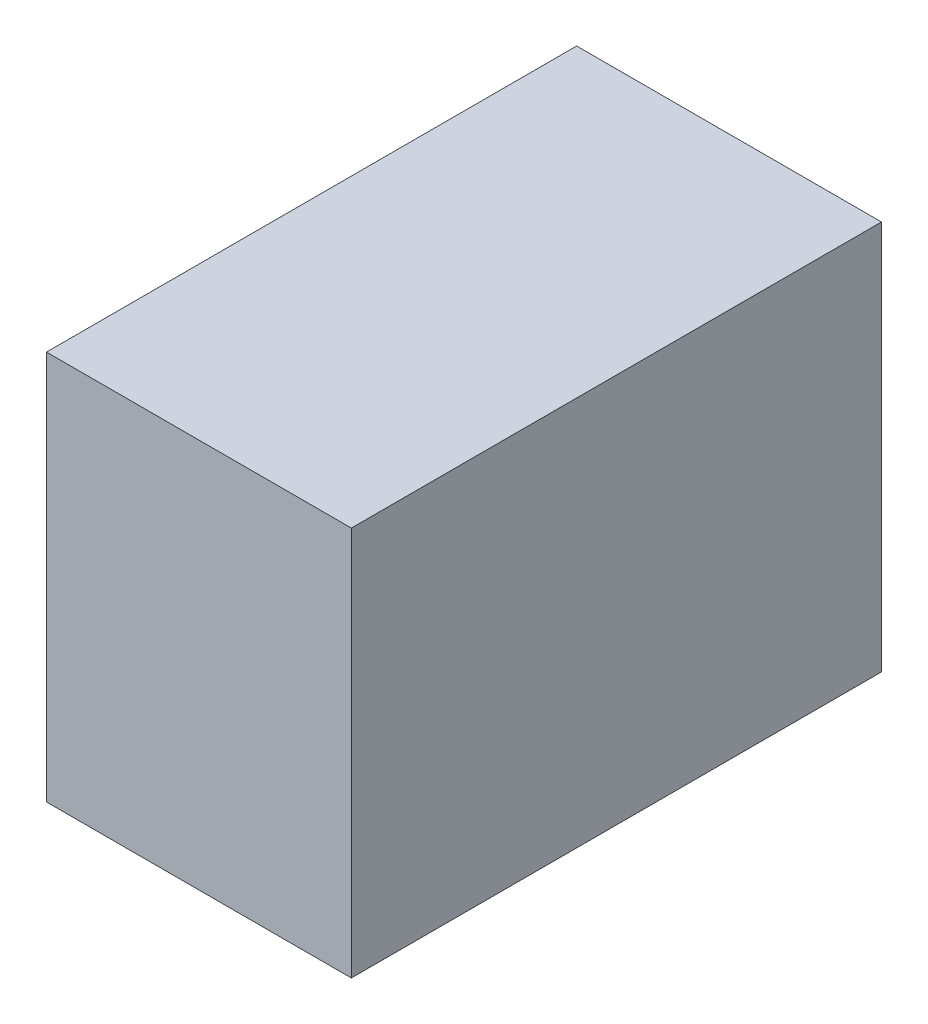
ISO-10303-21;
HEADER;
FILE_DESCRIPTION(('STEP AP214'),'2;1');
FILE_NAME('part.step','',(''),(''),'','','');
FILE_SCHEMA(('AUTOMOTIVE_DESIGN { 1 0 10303 214 1 1 1 1 }'));
ENDSEC;
DATA;
#1=APPLICATION_CONTEXT('core data for automotive mechanical design processes');
#2=APPLICATION_PROTOCOL_DEFINITION('international standard','automotive_design',2000,#1);
#3=PRODUCT_CONTEXT('',#1,'mechanical');
#4=PRODUCT('Part','Part','',(#3));
#5=PRODUCT_RELATED_PRODUCT_CATEGORY('part','',(#4));
#6=PRODUCT_DEFINITION_FORMATION('','',#4);
#7=PRODUCT_DEFINITION_CONTEXT('part definition',#1,'design');
#8=PRODUCT_DEFINITION('design','',#6,#7);
#9=PRODUCT_DEFINITION_SHAPE('','',#8);
#10=(LENGTH_UNIT() NAMED_UNIT(*) SI_UNIT(.MILLI.,.METRE.));
#11=(NAMED_UNIT(*) PLANE_ANGLE_UNIT() SI_UNIT($,.RADIAN.));
#12=(NAMED_UNIT(*) SI_UNIT($,.STERADIAN.) SOLID_ANGLE_UNIT());
#13=UNCERTAINTY_MEASURE_WITH_UNIT(LENGTH_MEASURE(1.E-05),#10,'distance_accuracy_value','');
#14=(GEOMETRIC_REPRESENTATION_CONTEXT(3) GLOBAL_UNCERTAINTY_ASSIGNED_CONTEXT((#13)) GLOBAL_UNIT_ASSIGNED_CONTEXT((#10,
#11,#12)) REPRESENTATION_CONTEXT('',''));
#15=CARTESIAN_POINT('',(0.,0.,0.));
#16=DIRECTION('',(0.,0.,1.));
#17=DIRECTION('',(1.,0.,0.));
#18=AXIS2_PLACEMENT_3D('',#15,#16,#17);
#19=CARTESIAN_POINT('',(2.875,3.675,10.));
#20=DIRECTION('',(-1.,0.,0.));
#21=DIRECTION('',(0.,-1.,0.));
#22=AXIS2_PLACEMENT_3D('',#19,#20,#21);
#23=PLANE('',#22);
#24=DIRECTION('',(0.,1.,0.));
#25=VECTOR('',#24,1.);
#26=CARTESIAN_POINT('',(2.875,3.675,0.));
#27=LINE('',#26,#25);
#28=CARTESIAN_POINT('',(2.875,-3.675,0.));
#29=VERTEX_POINT('',#28);
#30=CARTESIAN_POINT('',(2.875,3.675,0.));
#31=VERTEX_POINT('',#30);
#32=EDGE_CURVE('E96',#29,#31,#27,.T.);
#33=ORIENTED_EDGE('',*,*,#32,.T.);
#34=DIRECTION('',(0.,0.,-1.));
#35=VECTOR('',#34,1.);
#36=CARTESIAN_POINT('',(2.875,3.675,10.));
#37=LINE('',#36,#35);
#38=CARTESIAN_POINT('',(2.875,3.675,10.));
#39=VERTEX_POINT('',#38);
#40=EDGE_CURVE('E11',#39,#31,#37,.T.);
#41=ORIENTED_EDGE('',*,*,#40,.F.);
#42=DIRECTION('',(0.,1.,0.));
#43=VECTOR('',#42,1.);
#44=CARTESIAN_POINT('',(2.875,3.675,10.));
#45=LINE('',#44,#43);
#46=CARTESIAN_POINT('',(2.875,-3.675,10.));
#47=VERTEX_POINT('',#46);
#48=EDGE_CURVE('E84',#47,#39,#45,.T.);
#49=ORIENTED_EDGE('',*,*,#48,.F.);
#50=DIRECTION('',(0.,0.,-1.));
#51=VECTOR('',#50,1.);
#52=CARTESIAN_POINT('',(2.875,-3.675,10.));
#53=LINE('',#52,#51);
#54=EDGE_CURVE('E92',#47,#29,#53,.T.);
#55=ORIENTED_EDGE('',*,*,#54,.T.);
#56=EDGE_LOOP('',(#33,#41,#49,#55));
#57=FACE_BOUND('',#56,.T.);
#58=ADVANCED_FACE('F33',(#57),#23,.F.);
#59=CARTESIAN_POINT('',(-2.875,3.675,10.));
#60=DIRECTION('',(0.,-1.,0.));
#61=DIRECTION('',(0.,0.,-1.));
#62=AXIS2_PLACEMENT_3D('',#59,#60,#61);
#63=PLANE('',#62);
#64=DIRECTION('',(-1.,0.,0.));
#65=VECTOR('',#64,1.);
#66=CARTESIAN_POINT('',(-2.875,3.675,0.));
#67=LINE('',#66,#65);
#68=CARTESIAN_POINT('',(-2.875,3.675,0.));
#69=VERTEX_POINT('',#68);
#70=EDGE_CURVE('E88',#31,#69,#67,.T.);
#71=ORIENTED_EDGE('',*,*,#70,.T.);
#72=DIRECTION('',(0.,0.,-1.));
#73=VECTOR('',#72,1.);
#74=CARTESIAN_POINT('',(-2.875,3.675,10.));
#75=LINE('',#74,#73);
#76=CARTESIAN_POINT('',(-2.875,3.675,10.));
#77=VERTEX_POINT('',#76);
#78=EDGE_CURVE('E41',#77,#69,#75,.T.);
#79=ORIENTED_EDGE('',*,*,#78,.F.);
#80=DIRECTION('',(-1.,0.,0.));
#81=VECTOR('',#80,1.);
#82=CARTESIAN_POINT('',(-2.875,3.675,10.));
#83=LINE('',#82,#81);
#84=EDGE_CURVE('E79',#39,#77,#83,.T.);
#85=ORIENTED_EDGE('',*,*,#84,.F.);
#86=ORIENTED_EDGE('',*,*,#40,.T.);
#87=EDGE_LOOP('',(#71,#79,#85,#86));
#88=FACE_BOUND('',#87,.T.);
#89=ADVANCED_FACE('F87',(#88),#63,.F.);
#90=CARTESIAN_POINT('',(-2.875,3.675,10.));
#91=DIRECTION('',(1.,0.,0.));
#92=DIRECTION('',(0.,1.,0.));
#93=AXIS2_PLACEMENT_3D('',#90,#91,#92);
#94=PLANE('',#93);
#95=DIRECTION('',(0.,-1.,0.));
#96=VECTOR('',#95,1.);
#97=CARTESIAN_POINT('',(-2.875,3.675,0.));
#98=LINE('',#97,#96);
#99=CARTESIAN_POINT('',(-2.875,-3.675,0.));
#100=VERTEX_POINT('',#99);
#101=EDGE_CURVE('E66',#69,#100,#98,.T.);
#102=ORIENTED_EDGE('',*,*,#101,.T.);
#103=DIRECTION('',(0.,0.,-1.));
#104=VECTOR('',#103,1.);
#105=CARTESIAN_POINT('',(-2.875,-3.675,10.));
#106=LINE('',#105,#104);
#107=CARTESIAN_POINT('',(-2.875,-3.675,10.));
#108=VERTEX_POINT('',#107);
#109=EDGE_CURVE('E89',#108,#100,#106,.T.);
#110=ORIENTED_EDGE('',*,*,#109,.F.);
#111=DIRECTION('',(0.,-1.,0.));
#112=VECTOR('',#111,1.);
#113=CARTESIAN_POINT('',(-2.875,3.675,10.));
#114=LINE('',#113,#112);
#115=EDGE_CURVE('E82',#77,#108,#114,.T.);
#116=ORIENTED_EDGE('',*,*,#115,.F.);
#117=ORIENTED_EDGE('',*,*,#78,.T.);
#118=EDGE_LOOP('',(#102,#110,#116,#117));
#119=FACE_BOUND('',#118,.T.);
#120=ADVANCED_FACE('F90',(#119),#94,.F.);
#121=CARTESIAN_POINT('',(-2.875,-3.675,10.));
#122=DIRECTION('',(0.,1.,0.));
#123=DIRECTION('',(0.,0.,1.));
#124=AXIS2_PLACEMENT_3D('',#121,#122,#123);
#125=PLANE('',#124);
#126=DIRECTION('',(1.,0.,0.));
#127=VECTOR('',#126,1.);
#128=CARTESIAN_POINT('',(-2.875,-3.675,0.));
#129=LINE('',#128,#127);
#130=EDGE_CURVE('E72',#100,#29,#129,.T.);
#131=ORIENTED_EDGE('',*,*,#130,.T.);
#132=ORIENTED_EDGE('',*,*,#54,.F.);
#133=DIRECTION('',(1.,0.,0.));
#134=VECTOR('',#133,1.);
#135=CARTESIAN_POINT('',(-2.875,-3.675,10.));
#136=LINE('',#135,#134);
#137=EDGE_CURVE('E49',#108,#47,#136,.T.);
#138=ORIENTED_EDGE('',*,*,#137,.F.);
#139=ORIENTED_EDGE('',*,*,#109,.T.);
#140=EDGE_LOOP('',(#131,#132,#138,#139));
#141=FACE_BOUND('',#140,.T.);
#142=ADVANCED_FACE('F103',(#141),#125,.F.);
#143=CARTESIAN_POINT('',(0.,0.,10.));
#144=DIRECTION('',(0.,0.,1.));
#145=DIRECTION('',(1.,0.,0.));
#146=AXIS2_PLACEMENT_3D('',#143,#144,#145);
#147=PLANE('',#146);
#148=ORIENTED_EDGE('',*,*,#48,.T.);
#149=ORIENTED_EDGE('',*,*,#84,.T.);
#150=ORIENTED_EDGE('',*,*,#115,.T.);
#151=ORIENTED_EDGE('',*,*,#137,.T.);
#152=EDGE_LOOP('',(#148,#149,#150,#151));
#153=FACE_BOUND('',#152,.T.);
#154=ADVANCED_FACE('F80',(#153),#147,.T.);
#155=CARTESIAN_POINT('',(0.,0.,0.));
#156=DIRECTION('',(0.,0.,1.));
#157=DIRECTION('',(1.,0.,0.));
#158=AXIS2_PLACEMENT_3D('',#155,#156,#157);
#159=PLANE('',#158);
#160=ORIENTED_EDGE('',*,*,#32,.F.);
#161=ORIENTED_EDGE('',*,*,#130,.F.);
#162=ORIENTED_EDGE('',*,*,#101,.F.);
#163=ORIENTED_EDGE('',*,*,#70,.F.);
#164=EDGE_LOOP('',(#160,#161,#162,#163));
#165=FACE_BOUND('',#164,.T.);
#166=ADVANCED_FACE('F106',(#165),#159,.F.);
#167=CLOSED_SHELL('',(#58,#89,#120,#142,#154,#166));
#168=MANIFOLD_SOLID_BREP('B2',#167);
#169=ADVANCED_BREP_SHAPE_REPRESENTATION('',(#18,#168),#14);
#170=SHAPE_DEFINITION_REPRESENTATION(#9,#169);
ENDSEC;
END-ISO-10303-21;
